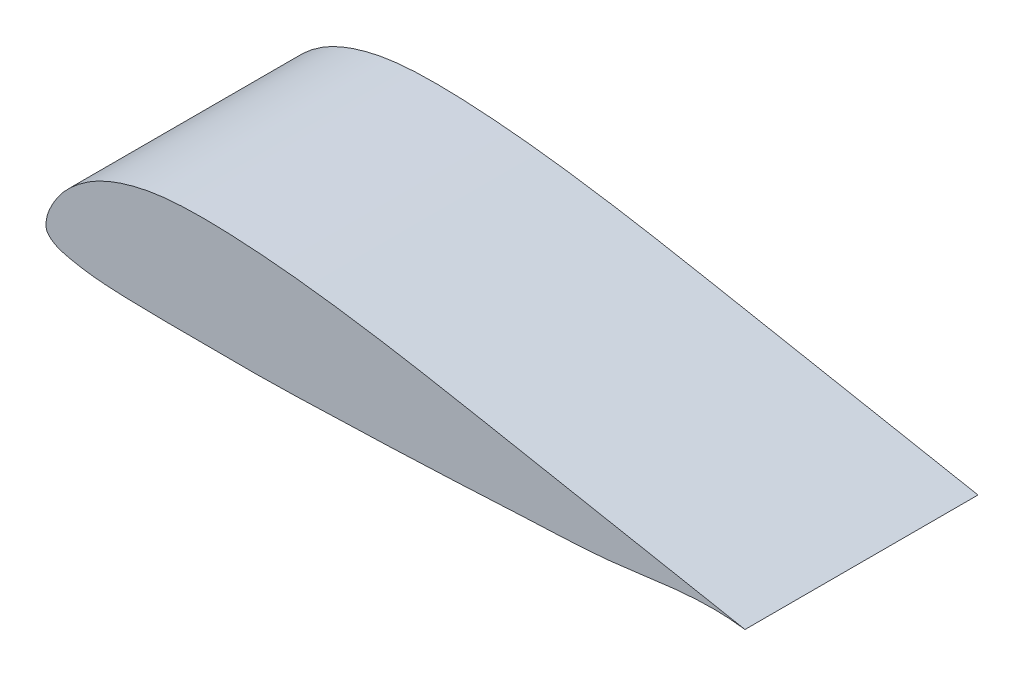
ISO-10303-21;
HEADER;
FILE_DESCRIPTION(('STEP AP214'),'2;1');
FILE_NAME('part.step','',(''),(''),'','','');
FILE_SCHEMA(('AUTOMOTIVE_DESIGN { 1 0 10303 214 1 1 1 1 }'));
ENDSEC;
DATA;
#1=APPLICATION_CONTEXT('core data for automotive mechanical design processes');
#2=APPLICATION_PROTOCOL_DEFINITION('international standard','automotive_design',2000,#1);
#3=PRODUCT_CONTEXT('',#1,'mechanical');
#4=PRODUCT('Part','Part','',(#3));
#5=PRODUCT_RELATED_PRODUCT_CATEGORY('part','',(#4));
#6=PRODUCT_DEFINITION_FORMATION('','',#4);
#7=PRODUCT_DEFINITION_CONTEXT('part definition',#1,'design');
#8=PRODUCT_DEFINITION('design','',#6,#7);
#9=PRODUCT_DEFINITION_SHAPE('','',#8);
#10=(LENGTH_UNIT() NAMED_UNIT(*) SI_UNIT(.MILLI.,.METRE.));
#11=(NAMED_UNIT(*) PLANE_ANGLE_UNIT() SI_UNIT($,.RADIAN.));
#12=(NAMED_UNIT(*) SI_UNIT($,.STERADIAN.) SOLID_ANGLE_UNIT());
#13=UNCERTAINTY_MEASURE_WITH_UNIT(LENGTH_MEASURE(1.E-05),#10,'distance_accuracy_value','');
#14=(GEOMETRIC_REPRESENTATION_CONTEXT(3) GLOBAL_UNCERTAINTY_ASSIGNED_CONTEXT((#13)) GLOBAL_UNIT_ASSIGNED_CONTEXT((#10,
#11,#12)) REPRESENTATION_CONTEXT('',''));
#15=CARTESIAN_POINT('',(0.,0.,0.));
#16=DIRECTION('',(0.,0.,1.));
#17=DIRECTION('',(1.,0.,0.));
#18=AXIS2_PLACEMENT_3D('',#15,#16,#17);
#19=CARTESIAN_POINT('',(0.,0.,100.));
#20=CARTESIAN_POINT('',(0.109965836651386,-2.0883264391805,100.));
#21=CARTESIAN_POINT('',(2.31888024153955,-4.14740245306368,100.));
#22=CARTESIAN_POINT('',(5.88534173679569,-5.93628372357495,100.));
#23=CARTESIAN_POINT('',(9.97351799315639,-6.94590656697944,100.));
#24=CARTESIAN_POINT('',(14.9659893039453,-7.95361062823166,100.));
#25=CARTESIAN_POINT('',(21.9774400191022,-8.88310837712347,100.));
#26=CARTESIAN_POINT('',(31.9883906822817,-9.54779837890146,100.));
#27=CARTESIAN_POINT('',(44.9988686295267,-9.76927437566725,100.));
#28=CARTESIAN_POINT('',(59.9994008038893,-9.96888514334198,100.));
#29=CARTESIAN_POINT('',(74.9998887889766,-9.93515364682519,100.));
#30=CARTESIAN_POINT('',(95.0039936430238,-10.0889732431827,100.));
#31=CARTESIAN_POINT('',(120.003712788522,-9.22318703638528,100.));
#32=CARTESIAN_POINT('',(150.005412936065,-8.28432428971769,100.));
#33=CARTESIAN_POINT('',(180.00744447413,-6.95827692109249,100.));
#34=CARTESIAN_POINT('',(209.992700766636,-5.28116927929796,100.));
#35=CARTESIAN_POINT('',(250.117414697461,-3.99234207838147,100.));
#36=CARTESIAN_POINT('',(279.730326225283,2.89067986235762,100.));
#37=CARTESIAN_POINT('',(300.,0.,100.));
#38=B_SPLINE_CURVE_WITH_KNOTS('',3,(#19,#20,#21,#22,#23,#24,#25,#26,#27,#28,#29,#30,#31,#32,#33,
#34,#35,#36,#37),.UNSPECIFIED.,.F.,.F.,(4,1,1,1,1,1,1,1,1,1,1,1,1,1,1,1,4),(0.,
0.0178554248975632,0.0289083824609038,0.0391746702797926,0.0593383672212079,0.0792898588221167,
0.109027696847427,0.158475597880215,0.207909101231953,0.257339529020612,0.306769901886762,
0.405660630778542,0.504578413590639,0.60353472229102,0.702518878831044,0.801545680703953,1.),.UNSPECIFIED.);
#39=DIRECTION('',(0.,0.,-1.));
#40=VECTOR('',#39,1.);
#41=SURFACE_OF_LINEAR_EXTRUSION('',#38,#40);
#42=CARTESIAN_POINT('',(0.,0.,0.));
#43=CARTESIAN_POINT('',(0.109965836651386,-2.0883264391805,0.));
#44=CARTESIAN_POINT('',(2.31888024153955,-4.14740245306368,0.));
#45=CARTESIAN_POINT('',(5.88534173679569,-5.93628372357495,0.));
#46=CARTESIAN_POINT('',(9.97351799315639,-6.94590656697944,0.));
#47=CARTESIAN_POINT('',(14.9659893039453,-7.95361062823166,0.));
#48=CARTESIAN_POINT('',(21.9774400191022,-8.88310837712347,0.));
#49=CARTESIAN_POINT('',(31.9883906822817,-9.54779837890146,0.));
#50=CARTESIAN_POINT('',(44.9988686295267,-9.76927437566725,0.));
#51=CARTESIAN_POINT('',(59.9994008038893,-9.96888514334198,0.));
#52=CARTESIAN_POINT('',(74.9998887889766,-9.93515364682519,0.));
#53=CARTESIAN_POINT('',(95.0039936430238,-10.0889732431827,0.));
#54=CARTESIAN_POINT('',(120.003712788522,-9.22318703638528,0.));
#55=CARTESIAN_POINT('',(150.005412936065,-8.28432428971769,0.));
#56=CARTESIAN_POINT('',(180.00744447413,-6.95827692109249,0.));
#57=CARTESIAN_POINT('',(209.992700766636,-5.28116927929796,0.));
#58=CARTESIAN_POINT('',(250.117414697461,-3.99234207838147,0.));
#59=CARTESIAN_POINT('',(279.730326225283,2.89067986235762,0.));
#60=CARTESIAN_POINT('',(300.,0.,0.));
#61=B_SPLINE_CURVE_WITH_KNOTS('',3,(#42,#43,#44,#45,#46,#47,#48,#49,#50,#51,#52,#53,#54,#55,#56,
#57,#58,#59,#60),.UNSPECIFIED.,.F.,.F.,(4,1,1,1,1,1,1,1,1,1,1,1,1,1,1,1,4),(0.,
0.0178554248975632,0.0289083824609038,0.0391746702797926,0.0593383672212079,0.0792898588221167,
0.109027696847427,0.158475597880215,0.207909101231953,0.257339529020612,0.306769901886762,
0.405660630778542,0.504578413590639,0.60353472229102,0.702518878831044,0.801545680703953,1.),.UNSPECIFIED.);
#62=CARTESIAN_POINT('',(0.,0.,0.));
#63=VERTEX_POINT('',#62);
#64=CARTESIAN_POINT('',(300.,0.,0.));
#65=VERTEX_POINT('',#64);
#66=EDGE_CURVE('E74',#63,#65,#61,.T.);
#67=ORIENTED_EDGE('',*,*,#66,.T.);
#68=DIRECTION('',(0.,0.,-1.));
#69=VECTOR('',#68,1.);
#70=CARTESIAN_POINT('',(300.,0.,100.));
#71=LINE('',#70,#69);
#72=CARTESIAN_POINT('',(300.,0.,100.));
#73=VERTEX_POINT('',#72);
#74=EDGE_CURVE('E11',#73,#65,#71,.T.);
#75=ORIENTED_EDGE('',*,*,#74,.F.);
#76=CARTESIAN_POINT('',(0.,0.,100.));
#77=VERTEX_POINT('',#76);
#78=EDGE_CURVE('E73',#77,#73,#38,.T.);
#79=ORIENTED_EDGE('',*,*,#78,.F.);
#80=DIRECTION('',(0.,0.,-1.));
#81=VECTOR('',#80,1.);
#82=CARTESIAN_POINT('',(0.,0.,100.));
#83=LINE('',#82,#81);
#84=EDGE_CURVE('E51',#77,#63,#83,.T.);
#85=ORIENTED_EDGE('',*,*,#84,.T.);
#86=EDGE_LOOP('',(#67,#75,#79,#85));
#87=FACE_BOUND('',#86,.T.);
#88=ADVANCED_FACE('F42',(#87),#41,.F.);
#89=CARTESIAN_POINT('',(300.,0.,100.));
#90=CARTESIAN_POINT('',(279.999350585836,3.79672158575542,100.));
#91=CARTESIAN_POINT('',(250.001298828327,9.50655682848918,100.));
#92=CARTESIAN_POINT('',(209.998051757509,17.0901647572662,100.));
#93=CARTESIAN_POINT('',(180.02517178521,22.8334587662388,100.));
#94=CARTESIAN_POINT('',(150.074444959498,28.3436609787057,100.));
#95=CARTESIAN_POINT('',(120.091360878581,32.9228143034198,100.));
#96=CARTESIAN_POINT('',(95.0451364950109,35.572759940455,100.));
#97=CARTESIAN_POINT('',(75.0110495425061,36.6564248276933,100.));
#98=CARTESIAN_POINT('',(59.9738918147364,36.7676964945204,100.));
#99=CARTESIAN_POINT('',(44.7961112121857,35.4945919594978,100.));
#100=CARTESIAN_POINT('',(31.6579601870588,32.151535746517,100.));
#101=CARTESIAN_POINT('',(21.6783217725593,27.7929022677321,100.));
#102=CARTESIAN_POINT('',(14.6816598197015,23.2224319750963,100.));
#103=CARTESIAN_POINT('',(9.68463668174293,18.90714615357,100.));
#104=CARTESIAN_POINT('',(5.71687199807895,14.3516732395056,100.));
#105=CARTESIAN_POINT('',(2.02311797957028,8.57164602520914,100.));
#106=CARTESIAN_POINT('',(-0.0615693147861757,3.63587778923502,100.));
#107=CARTESIAN_POINT('',(0.,0.,100.));
#108=B_SPLINE_CURVE_WITH_KNOTS('',3,(#89,#90,#91,#92,#93,#94,#95,#96,#97,#98,#99,#100,#101,#102,
#103,#104,#105,#106,#107),.UNSPECIFIED.,.F.,.F.,(4,1,1,1,1,1,1,1,1,1,1,1,1,1,1,1,4),(0.,
0.191317970003105,0.286976955004657,0.382635940006209,0.478123969117518,0.573153063374082,
0.667618396410154,0.714670745410487,0.76165960835572,0.80886449939419,0.857415615549946,
0.888332002110789,0.910749186537599,0.93572410977172,0.950117129082235,0.96737324121327,1.),.UNSPECIFIED.);
#109=DIRECTION('',(0.,0.,-1.));
#110=VECTOR('',#109,1.);
#111=SURFACE_OF_LINEAR_EXTRUSION('',#108,#110);
#112=CARTESIAN_POINT('',(300.,0.,0.));
#113=CARTESIAN_POINT('',(279.999350585836,3.79672158575542,0.));
#114=CARTESIAN_POINT('',(250.001298828327,9.50655682848918,0.));
#115=CARTESIAN_POINT('',(209.998051757509,17.0901647572662,0.));
#116=CARTESIAN_POINT('',(180.02517178521,22.8334587662388,0.));
#117=CARTESIAN_POINT('',(150.074444959498,28.3436609787057,0.));
#118=CARTESIAN_POINT('',(120.091360878581,32.9228143034198,0.));
#119=CARTESIAN_POINT('',(95.0451364950109,35.572759940455,0.));
#120=CARTESIAN_POINT('',(75.0110495425061,36.6564248276933,0.));
#121=CARTESIAN_POINT('',(59.9738918147364,36.7676964945204,0.));
#122=CARTESIAN_POINT('',(44.7961112121857,35.4945919594978,0.));
#123=CARTESIAN_POINT('',(31.6579601870588,32.151535746517,0.));
#124=CARTESIAN_POINT('',(21.6783217725593,27.7929022677321,0.));
#125=CARTESIAN_POINT('',(14.6816598197015,23.2224319750963,0.));
#126=CARTESIAN_POINT('',(9.68463668174293,18.90714615357,0.));
#127=CARTESIAN_POINT('',(5.71687199807895,14.3516732395056,0.));
#128=CARTESIAN_POINT('',(2.02311797957028,8.57164602520914,0.));
#129=CARTESIAN_POINT('',(-0.0615693147861757,3.63587778923502,0.));
#130=CARTESIAN_POINT('',(0.,0.,0.));
#131=B_SPLINE_CURVE_WITH_KNOTS('',3,(#112,#113,#114,#115,#116,#117,#118,#119,#120,#121,#122,
#123,#124,#125,#126,#127,#128,#129,#130),.UNSPECIFIED.,.F.,.F.,(4,1,1,1,1,1,1,1,1,1,1,1,1,1,1,1,
4),(0.,0.191317970003105,0.286976955004657,0.382635940006209,0.478123969117518,
0.573153063374082,0.667618396410154,0.714670745410487,0.76165960835572,0.80886449939419,
0.857415615549946,0.888332002110789,0.910749186537599,0.93572410977172,0.950117129082235,
0.96737324121327,1.),.UNSPECIFIED.);
#132=EDGE_CURVE('E66',#65,#63,#131,.T.);
#133=ORIENTED_EDGE('',*,*,#132,.T.);
#134=ORIENTED_EDGE('',*,*,#84,.F.);
#135=EDGE_CURVE('E58',#73,#77,#108,.T.);
#136=ORIENTED_EDGE('',*,*,#135,.F.);
#137=ORIENTED_EDGE('',*,*,#74,.T.);
#138=EDGE_LOOP('',(#133,#134,#136,#137));
#139=FACE_BOUND('',#138,.T.);
#140=ADVANCED_FACE('F69',(#139),#111,.F.);
#141=CARTESIAN_POINT('',(148.611624867908,-8.27199616043457,100.));
#142=DIRECTION('',(0.,0.,-1.));
#143=DIRECTION('',(-1.,0.,0.));
#144=AXIS2_PLACEMENT_3D('',#141,#142,#143);
#145=PLANE('',#144);
#146=ORIENTED_EDGE('',*,*,#78,.T.);
#147=ORIENTED_EDGE('',*,*,#135,.T.);
#148=EDGE_LOOP('',(#146,#147));
#149=FACE_BOUND('',#148,.T.);
#150=ADVANCED_FACE('F101',(#149),#145,.F.);
#151=CARTESIAN_POINT('',(148.611624867908,-8.27199616043457,0.));
#152=DIRECTION('',(0.,0.,-1.));
#153=DIRECTION('',(-1.,0.,0.));
#154=AXIS2_PLACEMENT_3D('',#151,#152,#153);
#155=PLANE('',#154);
#156=ORIENTED_EDGE('',*,*,#66,.F.);
#157=ORIENTED_EDGE('',*,*,#132,.F.);
#158=EDGE_LOOP('',(#156,#157));
#159=FACE_BOUND('',#158,.T.);
#160=ADVANCED_FACE('F77',(#159),#155,.T.);
#161=CLOSED_SHELL('',(#88,#140,#150,#160));
#162=MANIFOLD_SOLID_BREP('B2',#161);
#163=ADVANCED_BREP_SHAPE_REPRESENTATION('',(#18,#162),#14);
#164=SHAPE_DEFINITION_REPRESENTATION(#9,#163);
ENDSEC;
END-ISO-10303-21;
